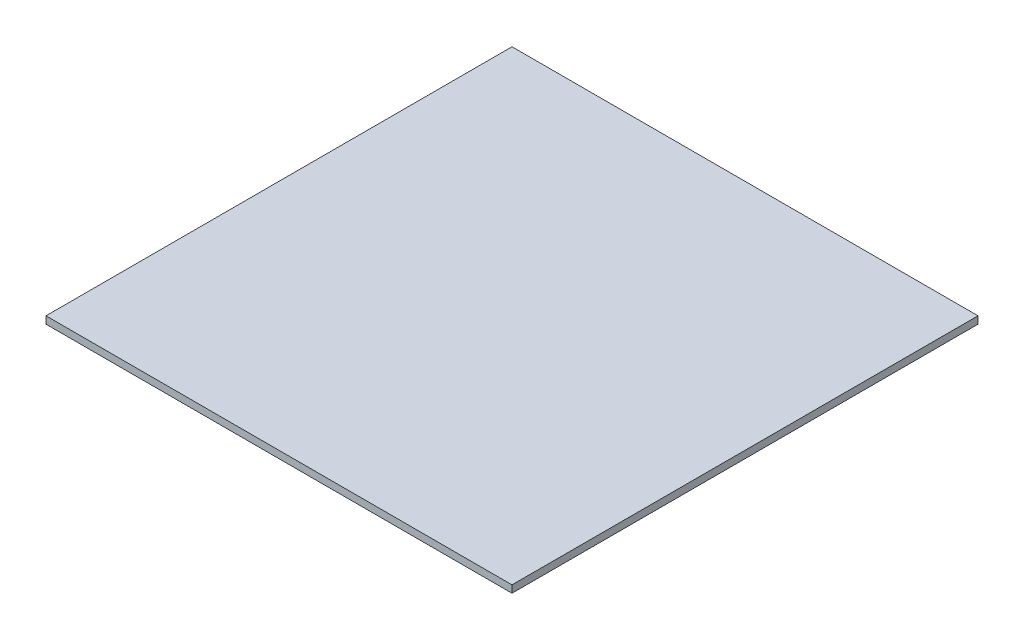
ISO-10303-21;
HEADER;
FILE_DESCRIPTION(('STEP AP214'),'2;1');
FILE_NAME('part.step','',(''),(''),'','','');
FILE_SCHEMA(('AUTOMOTIVE_DESIGN { 1 0 10303 214 1 1 1 1 }'));
ENDSEC;
DATA;
#1=APPLICATION_CONTEXT('core data for automotive mechanical design processes');
#2=APPLICATION_PROTOCOL_DEFINITION('international standard','automotive_design',2000,#1);
#3=PRODUCT_CONTEXT('',#1,'mechanical');
#4=PRODUCT('Part','Part','',(#3));
#5=PRODUCT_RELATED_PRODUCT_CATEGORY('part','',(#4));
#6=PRODUCT_DEFINITION_FORMATION('','',#4);
#7=PRODUCT_DEFINITION_CONTEXT('part definition',#1,'design');
#8=PRODUCT_DEFINITION('design','',#6,#7);
#9=PRODUCT_DEFINITION_SHAPE('','',#8);
#10=(LENGTH_UNIT() NAMED_UNIT(*) SI_UNIT(.MILLI.,.METRE.));
#11=(NAMED_UNIT(*) PLANE_ANGLE_UNIT() SI_UNIT($,.RADIAN.));
#12=(NAMED_UNIT(*) SI_UNIT($,.STERADIAN.) SOLID_ANGLE_UNIT());
#13=UNCERTAINTY_MEASURE_WITH_UNIT(LENGTH_MEASURE(1.E-05),#10,'distance_accuracy_value','');
#14=(GEOMETRIC_REPRESENTATION_CONTEXT(3) GLOBAL_UNCERTAINTY_ASSIGNED_CONTEXT((#13)) GLOBAL_UNIT_ASSIGNED_CONTEXT((#10,
#11,#12)) REPRESENTATION_CONTEXT('',''));
#15=CARTESIAN_POINT('',(0.,0.,0.));
#16=DIRECTION('',(0.,0.,1.));
#17=DIRECTION('',(1.,0.,0.));
#18=AXIS2_PLACEMENT_3D('',#15,#16,#17);
#19=CARTESIAN_POINT('',(0.,12.7,0.));
#20=DIRECTION('',(1.,0.,0.));
#21=DIRECTION('',(0.,0.,-1.));
#22=AXIS2_PLACEMENT_3D('',#19,#20,#21);
#23=PLANE('',#22);
#24=DIRECTION('',(0.,0.,1.));
#25=VECTOR('',#24,1.);
#26=CARTESIAN_POINT('',(0.,0.,0.));
#27=LINE('',#26,#25);
#28=CARTESIAN_POINT('',(0.,0.,-812.8));
#29=VERTEX_POINT('',#28);
#30=CARTESIAN_POINT('',(0.,0.,0.));
#31=VERTEX_POINT('',#30);
#32=EDGE_CURVE('E95',#29,#31,#27,.T.);
#33=ORIENTED_EDGE('',*,*,#32,.T.);
#34=DIRECTION('',(0.,-1.,0.));
#35=VECTOR('',#34,1.);
#36=CARTESIAN_POINT('',(0.,12.7,0.));
#37=LINE('',#36,#35);
#38=CARTESIAN_POINT('',(0.,12.7,0.));
#39=VERTEX_POINT('',#38);
#40=EDGE_CURVE('E11',#39,#31,#37,.T.);
#41=ORIENTED_EDGE('',*,*,#40,.F.);
#42=DIRECTION('',(0.,0.,1.));
#43=VECTOR('',#42,1.);
#44=CARTESIAN_POINT('',(0.,12.7,0.));
#45=LINE('',#44,#43);
#46=CARTESIAN_POINT('',(0.,12.7,-812.8));
#47=VERTEX_POINT('',#46);
#48=EDGE_CURVE('E83',#47,#39,#45,.T.);
#49=ORIENTED_EDGE('',*,*,#48,.F.);
#50=DIRECTION('',(0.,-1.,0.));
#51=VECTOR('',#50,1.);
#52=CARTESIAN_POINT('',(0.,12.7,-812.8));
#53=LINE('',#52,#51);
#54=EDGE_CURVE('E91',#47,#29,#53,.T.);
#55=ORIENTED_EDGE('',*,*,#54,.T.);
#56=EDGE_LOOP('',(#33,#41,#49,#55));
#57=FACE_BOUND('',#56,.T.);
#58=ADVANCED_FACE('F32',(#57),#23,.F.);
#59=CARTESIAN_POINT('',(0.,12.7,0.));
#60=DIRECTION('',(0.,0.,-1.));
#61=DIRECTION('',(-1.,0.,0.));
#62=AXIS2_PLACEMENT_3D('',#59,#60,#61);
#63=PLANE('',#62);
#64=DIRECTION('',(1.,0.,0.));
#65=VECTOR('',#64,1.);
#66=CARTESIAN_POINT('',(0.,0.,0.));
#67=LINE('',#66,#65);
#68=CARTESIAN_POINT('',(812.8,0.,0.));
#69=VERTEX_POINT('',#68);
#70=EDGE_CURVE('E87',#31,#69,#67,.T.);
#71=ORIENTED_EDGE('',*,*,#70,.T.);
#72=DIRECTION('',(0.,-1.,0.));
#73=VECTOR('',#72,1.);
#74=CARTESIAN_POINT('',(812.8,12.7,0.));
#75=LINE('',#74,#73);
#76=CARTESIAN_POINT('',(812.8,12.7,0.));
#77=VERTEX_POINT('',#76);
#78=EDGE_CURVE('E40',#77,#69,#75,.T.);
#79=ORIENTED_EDGE('',*,*,#78,.F.);
#80=DIRECTION('',(1.,0.,0.));
#81=VECTOR('',#80,1.);
#82=CARTESIAN_POINT('',(0.,12.7,0.));
#83=LINE('',#82,#81);
#84=EDGE_CURVE('E78',#39,#77,#83,.T.);
#85=ORIENTED_EDGE('',*,*,#84,.F.);
#86=ORIENTED_EDGE('',*,*,#40,.T.);
#87=EDGE_LOOP('',(#71,#79,#85,#86));
#88=FACE_BOUND('',#87,.T.);
#89=ADVANCED_FACE('F86',(#88),#63,.F.);
#90=CARTESIAN_POINT('',(812.8,12.7,0.));
#91=DIRECTION('',(-1.,0.,0.));
#92=DIRECTION('',(0.,0.,1.));
#93=AXIS2_PLACEMENT_3D('',#90,#91,#92);
#94=PLANE('',#93);
#95=DIRECTION('',(0.,0.,-1.));
#96=VECTOR('',#95,1.);
#97=CARTESIAN_POINT('',(812.8,0.,0.));
#98=LINE('',#97,#96);
#99=CARTESIAN_POINT('',(812.8,0.,-812.8));
#100=VERTEX_POINT('',#99);
#101=EDGE_CURVE('E65',#69,#100,#98,.T.);
#102=ORIENTED_EDGE('',*,*,#101,.T.);
#103=DIRECTION('',(0.,-1.,0.));
#104=VECTOR('',#103,1.);
#105=CARTESIAN_POINT('',(812.8,12.7,-812.8));
#106=LINE('',#105,#104);
#107=CARTESIAN_POINT('',(812.8,12.7,-812.8));
#108=VERTEX_POINT('',#107);
#109=EDGE_CURVE('E88',#108,#100,#106,.T.);
#110=ORIENTED_EDGE('',*,*,#109,.F.);
#111=DIRECTION('',(0.,0.,-1.));
#112=VECTOR('',#111,1.);
#113=CARTESIAN_POINT('',(812.8,12.7,0.));
#114=LINE('',#113,#112);
#115=EDGE_CURVE('E81',#77,#108,#114,.T.);
#116=ORIENTED_EDGE('',*,*,#115,.F.);
#117=ORIENTED_EDGE('',*,*,#78,.T.);
#118=EDGE_LOOP('',(#102,#110,#116,#117));
#119=FACE_BOUND('',#118,.T.);
#120=ADVANCED_FACE('F89',(#119),#94,.F.);
#121=CARTESIAN_POINT('',(0.,12.7,-812.8));
#122=DIRECTION('',(0.,0.,1.));
#123=DIRECTION('',(1.,0.,0.));
#124=AXIS2_PLACEMENT_3D('',#121,#122,#123);
#125=PLANE('',#124);
#126=DIRECTION('',(-1.,0.,0.));
#127=VECTOR('',#126,1.);
#128=CARTESIAN_POINT('',(0.,0.,-812.8));
#129=LINE('',#128,#127);
#130=EDGE_CURVE('E71',#100,#29,#129,.T.);
#131=ORIENTED_EDGE('',*,*,#130,.T.);
#132=ORIENTED_EDGE('',*,*,#54,.F.);
#133=DIRECTION('',(-1.,0.,0.));
#134=VECTOR('',#133,1.);
#135=CARTESIAN_POINT('',(0.,12.7,-812.8));
#136=LINE('',#135,#134);
#137=EDGE_CURVE('E48',#108,#47,#136,.T.);
#138=ORIENTED_EDGE('',*,*,#137,.F.);
#139=ORIENTED_EDGE('',*,*,#109,.T.);
#140=EDGE_LOOP('',(#131,#132,#138,#139));
#141=FACE_BOUND('',#140,.T.);
#142=ADVANCED_FACE('F102',(#141),#125,.F.);
#143=CARTESIAN_POINT('',(0.,12.7,-812.8));
#144=DIRECTION('',(0.,-1.,0.));
#145=DIRECTION('',(0.,0.,-1.));
#146=AXIS2_PLACEMENT_3D('',#143,#144,#145);
#147=PLANE('',#146);
#148=ORIENTED_EDGE('',*,*,#48,.T.);
#149=ORIENTED_EDGE('',*,*,#84,.T.);
#150=ORIENTED_EDGE('',*,*,#115,.T.);
#151=ORIENTED_EDGE('',*,*,#137,.T.);
#152=EDGE_LOOP('',(#148,#149,#150,#151));
#153=FACE_BOUND('',#152,.T.);
#154=ADVANCED_FACE('F79',(#153),#147,.F.);
#155=CARTESIAN_POINT('',(0.,0.,-812.8));
#156=DIRECTION('',(0.,-1.,0.));
#157=DIRECTION('',(0.,0.,-1.));
#158=AXIS2_PLACEMENT_3D('',#155,#156,#157);
#159=PLANE('',#158);
#160=ORIENTED_EDGE('',*,*,#32,.F.);
#161=ORIENTED_EDGE('',*,*,#130,.F.);
#162=ORIENTED_EDGE('',*,*,#101,.F.);
#163=ORIENTED_EDGE('',*,*,#70,.F.);
#164=EDGE_LOOP('',(#160,#161,#162,#163));
#165=FACE_BOUND('',#164,.T.);
#166=ADVANCED_FACE('F105',(#165),#159,.T.);
#167=CLOSED_SHELL('',(#58,#89,#120,#142,#154,#166));
#168=MANIFOLD_SOLID_BREP('B2',#167);
#169=ADVANCED_BREP_SHAPE_REPRESENTATION('',(#18,#168),#14);
#170=SHAPE_DEFINITION_REPRESENTATION(#9,#169);
ENDSEC;
END-ISO-10303-21;
